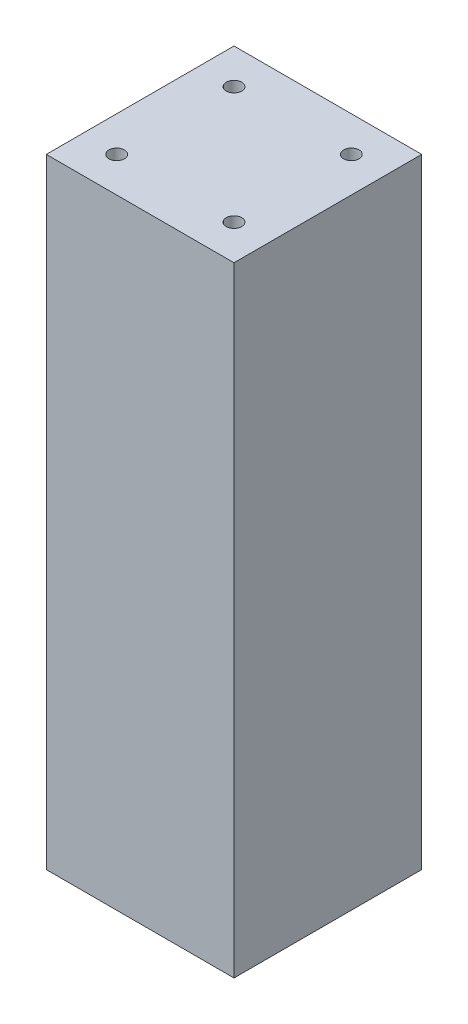
ISO-10303-21;
HEADER;
FILE_DESCRIPTION(('STEP AP214'),'2;1');
FILE_NAME('part.step','',(''),(''),'','','');
FILE_SCHEMA(('AUTOMOTIVE_DESIGN { 1 0 10303 214 1 1 1 1 }'));
ENDSEC;
DATA;
#1=APPLICATION_CONTEXT('core data for automotive mechanical design processes');
#2=APPLICATION_PROTOCOL_DEFINITION('international standard','automotive_design',2000,#1);
#3=PRODUCT_CONTEXT('',#1,'mechanical');
#4=PRODUCT('Part','Part','',(#3));
#5=PRODUCT_RELATED_PRODUCT_CATEGORY('part','',(#4));
#6=PRODUCT_DEFINITION_FORMATION('','',#4);
#7=PRODUCT_DEFINITION_CONTEXT('part definition',#1,'design');
#8=PRODUCT_DEFINITION('design','',#6,#7);
#9=PRODUCT_DEFINITION_SHAPE('','',#8);
#10=(LENGTH_UNIT() NAMED_UNIT(*) SI_UNIT(.MILLI.,.METRE.));
#11=(NAMED_UNIT(*) PLANE_ANGLE_UNIT() SI_UNIT($,.RADIAN.));
#12=(NAMED_UNIT(*) SI_UNIT($,.STERADIAN.) SOLID_ANGLE_UNIT());
#13=UNCERTAINTY_MEASURE_WITH_UNIT(LENGTH_MEASURE(1.E-05),#10,'distance_accuracy_value','');
#14=(GEOMETRIC_REPRESENTATION_CONTEXT(3) GLOBAL_UNCERTAINTY_ASSIGNED_CONTEXT((#13)) GLOBAL_UNIT_ASSIGNED_CONTEXT((#10,
#11,#12)) REPRESENTATION_CONTEXT('',''));
#15=CARTESIAN_POINT('',(0.,0.,0.));
#16=DIRECTION('',(0.,0.,1.));
#17=DIRECTION('',(1.,0.,0.));
#18=AXIS2_PLACEMENT_3D('',#15,#16,#17);
#19=CARTESIAN_POINT('',(-20.,66.,-20.));
#20=DIRECTION('',(1.,0.,0.));
#21=DIRECTION('',(0.,0.,-1.));
#22=AXIS2_PLACEMENT_3D('',#19,#20,#21);
#23=PLANE('',#22);
#24=DIRECTION('',(0.,0.,1.));
#25=VECTOR('',#24,1.);
#26=CARTESIAN_POINT('',(-20.,-66.,-20.));
#27=LINE('',#26,#25);
#28=CARTESIAN_POINT('',(-20.,-66.,-20.));
#29=VERTEX_POINT('',#28);
#30=CARTESIAN_POINT('',(-20.,-66.,20.));
#31=VERTEX_POINT('',#30);
#32=EDGE_CURVE('E171',#29,#31,#27,.T.);
#33=ORIENTED_EDGE('',*,*,#32,.T.);
#34=DIRECTION('',(0.,-1.,0.));
#35=VECTOR('',#34,1.);
#36=CARTESIAN_POINT('',(-20.,66.,20.));
#37=LINE('',#36,#35);
#38=CARTESIAN_POINT('',(-20.,66.,20.));
#39=VERTEX_POINT('',#38);
#40=EDGE_CURVE('E11',#39,#31,#37,.T.);
#41=ORIENTED_EDGE('',*,*,#40,.F.);
#42=DIRECTION('',(0.,0.,1.));
#43=VECTOR('',#42,1.);
#44=CARTESIAN_POINT('',(-20.,66.,-20.));
#45=LINE('',#44,#43);
#46=CARTESIAN_POINT('',(-20.,66.,-20.));
#47=VERTEX_POINT('',#46);
#48=EDGE_CURVE('E172',#47,#39,#45,.T.);
#49=ORIENTED_EDGE('',*,*,#48,.F.);
#50=DIRECTION('',(0.,-1.,0.));
#51=VECTOR('',#50,1.);
#52=CARTESIAN_POINT('',(-20.,66.,-20.));
#53=LINE('',#52,#51);
#54=EDGE_CURVE('E178',#47,#29,#53,.T.);
#55=ORIENTED_EDGE('',*,*,#54,.T.);
#56=EDGE_LOOP('',(#33,#41,#49,#55));
#57=FACE_BOUND('',#56,.T.);
#58=ADVANCED_FACE('F36',(#57),#23,.F.);
#59=CARTESIAN_POINT('',(-20.,66.,20.));
#60=DIRECTION('',(0.,0.,-1.));
#61=DIRECTION('',(-1.,0.,0.));
#62=AXIS2_PLACEMENT_3D('',#59,#60,#61);
#63=PLANE('',#62);
#64=DIRECTION('',(1.,0.,0.));
#65=VECTOR('',#64,1.);
#66=CARTESIAN_POINT('',(-20.,-66.,20.));
#67=LINE('',#66,#65);
#68=CARTESIAN_POINT('',(20.,-66.,20.));
#69=VERTEX_POINT('',#68);
#70=EDGE_CURVE('E181',#31,#69,#67,.T.);
#71=ORIENTED_EDGE('',*,*,#70,.T.);
#72=DIRECTION('',(0.,-1.,0.));
#73=VECTOR('',#72,1.);
#74=CARTESIAN_POINT('',(20.,66.,20.));
#75=LINE('',#74,#73);
#76=CARTESIAN_POINT('',(20.,66.,20.));
#77=VERTEX_POINT('',#76);
#78=EDGE_CURVE('E44',#77,#69,#75,.T.);
#79=ORIENTED_EDGE('',*,*,#78,.F.);
#80=DIRECTION('',(1.,0.,0.));
#81=VECTOR('',#80,1.);
#82=CARTESIAN_POINT('',(-20.,66.,20.));
#83=LINE('',#82,#81);
#84=EDGE_CURVE('E83',#39,#77,#83,.T.);
#85=ORIENTED_EDGE('',*,*,#84,.F.);
#86=ORIENTED_EDGE('',*,*,#40,.T.);
#87=EDGE_LOOP('',(#71,#79,#85,#86));
#88=FACE_BOUND('',#87,.T.);
#89=ADVANCED_FACE('F205',(#88),#63,.F.);
#90=CARTESIAN_POINT('',(20.,66.,-20.));
#91=DIRECTION('',(-1.,0.,0.));
#92=DIRECTION('',(0.,0.,1.));
#93=AXIS2_PLACEMENT_3D('',#90,#91,#92);
#94=PLANE('',#93);
#95=DIRECTION('',(0.,0.,-1.));
#96=VECTOR('',#95,1.);
#97=CARTESIAN_POINT('',(20.,-66.,-20.));
#98=LINE('',#97,#96);
#99=CARTESIAN_POINT('',(20.,-66.,-20.));
#100=VERTEX_POINT('',#99);
#101=EDGE_CURVE('E70',#69,#100,#98,.T.);
#102=ORIENTED_EDGE('',*,*,#101,.T.);
#103=DIRECTION('',(0.,-1.,0.));
#104=VECTOR('',#103,1.);
#105=CARTESIAN_POINT('',(20.,66.,-20.));
#106=LINE('',#105,#104);
#107=CARTESIAN_POINT('',(20.,66.,-20.));
#108=VERTEX_POINT('',#107);
#109=EDGE_CURVE('E186',#108,#100,#106,.T.);
#110=ORIENTED_EDGE('',*,*,#109,.F.);
#111=DIRECTION('',(0.,0.,-1.));
#112=VECTOR('',#111,1.);
#113=CARTESIAN_POINT('',(20.,66.,-20.));
#114=LINE('',#113,#112);
#115=EDGE_CURVE('E175',#77,#108,#114,.T.);
#116=ORIENTED_EDGE('',*,*,#115,.F.);
#117=ORIENTED_EDGE('',*,*,#78,.T.);
#118=EDGE_LOOP('',(#102,#110,#116,#117));
#119=FACE_BOUND('',#118,.T.);
#120=ADVANCED_FACE('F188',(#119),#94,.F.);
#121=CARTESIAN_POINT('',(-20.,66.,-20.));
#122=DIRECTION('',(0.,0.,1.));
#123=DIRECTION('',(1.,0.,0.));
#124=AXIS2_PLACEMENT_3D('',#121,#122,#123);
#125=PLANE('',#124);
#126=DIRECTION('',(-1.,0.,0.));
#127=VECTOR('',#126,1.);
#128=CARTESIAN_POINT('',(-20.,-66.,-20.));
#129=LINE('',#128,#127);
#130=EDGE_CURVE('E76',#100,#29,#129,.T.);
#131=ORIENTED_EDGE('',*,*,#130,.T.);
#132=ORIENTED_EDGE('',*,*,#54,.F.);
#133=DIRECTION('',(-1.,0.,0.));
#134=VECTOR('',#133,1.);
#135=CARTESIAN_POINT('',(-20.,66.,-20.));
#136=LINE('',#135,#134);
#137=EDGE_CURVE('E52',#108,#47,#136,.T.);
#138=ORIENTED_EDGE('',*,*,#137,.F.);
#139=ORIENTED_EDGE('',*,*,#109,.T.);
#140=EDGE_LOOP('',(#131,#132,#138,#139));
#141=FACE_BOUND('',#140,.T.);
#142=ADVANCED_FACE('F195',(#141),#125,.F.);
#143=CARTESIAN_POINT('',(0.,66.,0.));
#144=DIRECTION('',(0.,1.,0.));
#145=DIRECTION('',(0.,0.,1.));
#146=AXIS2_PLACEMENT_3D('',#143,#144,#145);
#147=PLANE('',#146);
#148=CARTESIAN_POINT('',(-12.5,66.,-12.5));
#149=DIRECTION('',(0.,1.,0.));
#150=DIRECTION('',(0.,0.,1.));
#151=AXIS2_PLACEMENT_3D('',#148,#149,#150);
#152=CIRCLE('',#151,1.65);
#153=CARTESIAN_POINT('',(-12.5,66.,-10.85));
#154=VERTEX_POINT('',#153);
#155=EDGE_CURVE('E147',#154,#154,#152,.T.);
#156=ORIENTED_EDGE('',*,*,#155,.F.);
#157=EDGE_LOOP('',(#156));
#158=FACE_BOUND('',#157,.T.);
#159=CARTESIAN_POINT('',(12.5,66.,-12.5));
#160=DIRECTION('',(0.,1.,0.));
#161=DIRECTION('',(0.,0.,1.));
#162=AXIS2_PLACEMENT_3D('',#159,#160,#161);
#163=CIRCLE('',#162,1.65);
#164=CARTESIAN_POINT('',(12.5,66.,-10.85));
#165=VERTEX_POINT('',#164);
#166=EDGE_CURVE('E153',#165,#165,#163,.T.);
#167=ORIENTED_EDGE('',*,*,#166,.F.);
#168=EDGE_LOOP('',(#167));
#169=FACE_BOUND('',#168,.T.);
#170=CARTESIAN_POINT('',(12.5,66.,12.5));
#171=DIRECTION('',(0.,1.,0.));
#172=DIRECTION('',(0.,0.,1.));
#173=AXIS2_PLACEMENT_3D('',#170,#171,#172);
#174=CIRCLE('',#173,1.65);
#175=CARTESIAN_POINT('',(12.5,66.,14.15));
#176=VERTEX_POINT('',#175);
#177=EDGE_CURVE('E159',#176,#176,#174,.T.);
#178=ORIENTED_EDGE('',*,*,#177,.F.);
#179=EDGE_LOOP('',(#178));
#180=FACE_BOUND('',#179,.T.);
#181=CARTESIAN_POINT('',(-12.5,66.,12.5));
#182=DIRECTION('',(0.,1.,0.));
#183=DIRECTION('',(0.,0.,1.));
#184=AXIS2_PLACEMENT_3D('',#181,#182,#183);
#185=CIRCLE('',#184,1.65);
#186=CARTESIAN_POINT('',(-12.5,66.,14.15));
#187=VERTEX_POINT('',#186);
#188=EDGE_CURVE('E165',#187,#187,#185,.T.);
#189=ORIENTED_EDGE('',*,*,#188,.F.);
#190=EDGE_LOOP('',(#189));
#191=FACE_BOUND('',#190,.T.);
#192=ORIENTED_EDGE('',*,*,#48,.T.);
#193=ORIENTED_EDGE('',*,*,#84,.T.);
#194=ORIENTED_EDGE('',*,*,#115,.T.);
#195=ORIENTED_EDGE('',*,*,#137,.T.);
#196=EDGE_LOOP('',(#192,#193,#194,#195));
#197=FACE_BOUND('',#196,.T.);
#198=ADVANCED_FACE('F197',(#158,#169,#180,#191,#197),#147,.T.);
#199=CARTESIAN_POINT('',(0.,-66.,0.));
#200=DIRECTION('',(0.,1.,0.));
#201=DIRECTION('',(0.,0.,1.));
#202=AXIS2_PLACEMENT_3D('',#199,#200,#201);
#203=PLANE('',#202);
#204=CARTESIAN_POINT('',(-10.,-66.,0.));
#205=DIRECTION('',(0.,-1.,0.));
#206=DIRECTION('',(0.,0.,-1.));
#207=AXIS2_PLACEMENT_3D('',#204,#205,#206);
#208=CIRCLE('',#207,3.);
#209=CARTESIAN_POINT('',(-10.,-66.,-3.));
#210=VERTEX_POINT('',#209);
#211=EDGE_CURVE('E119',#210,#210,#208,.T.);
#212=ORIENTED_EDGE('',*,*,#211,.F.);
#213=EDGE_LOOP('',(#212));
#214=FACE_BOUND('',#213,.T.);
#215=CARTESIAN_POINT('',(10.,-66.,0.));
#216=DIRECTION('',(0.,-1.,0.));
#217=DIRECTION('',(0.,0.,-1.));
#218=AXIS2_PLACEMENT_3D('',#215,#216,#217);
#219=CIRCLE('',#218,3.);
#220=CARTESIAN_POINT('',(10.,-66.,-3.));
#221=VERTEX_POINT('',#220);
#222=EDGE_CURVE('E118',#221,#221,#219,.T.);
#223=ORIENTED_EDGE('',*,*,#222,.F.);
#224=EDGE_LOOP('',(#223));
#225=FACE_BOUND('',#224,.T.);
#226=CARTESIAN_POINT('',(-10.,-66.,-12.5));
#227=DIRECTION('',(0.,-1.,0.));
#228=DIRECTION('',(0.,0.,-1.));
#229=AXIS2_PLACEMENT_3D('',#226,#227,#228);
#230=CIRCLE('',#229,3.025);
#231=CARTESIAN_POINT('',(-10.,-66.,-15.525));
#232=VERTEX_POINT('',#231);
#233=EDGE_CURVE('E129',#232,#232,#230,.T.);
#234=ORIENTED_EDGE('',*,*,#233,.F.);
#235=EDGE_LOOP('',(#234));
#236=FACE_BOUND('',#235,.T.);
#237=CARTESIAN_POINT('',(-10.,-66.,12.5));
#238=DIRECTION('',(0.,-1.,0.));
#239=DIRECTION('',(0.,0.,-1.));
#240=AXIS2_PLACEMENT_3D('',#237,#238,#239);
#241=CIRCLE('',#240,3.025);
#242=CARTESIAN_POINT('',(-10.,-66.,9.475));
#243=VERTEX_POINT('',#242);
#244=EDGE_CURVE('E138',#243,#243,#241,.T.);
#245=ORIENTED_EDGE('',*,*,#244,.F.);
#246=EDGE_LOOP('',(#245));
#247=FACE_BOUND('',#246,.T.);
#248=ORIENTED_EDGE('',*,*,#32,.F.);
#249=ORIENTED_EDGE('',*,*,#130,.F.);
#250=ORIENTED_EDGE('',*,*,#101,.F.);
#251=ORIENTED_EDGE('',*,*,#70,.F.);
#252=EDGE_LOOP('',(#248,#249,#250,#251));
#253=FACE_BOUND('',#252,.T.);
#254=ADVANCED_FACE('F191',(#214,#225,#236,#247,#253),#203,.F.);
#255=CARTESIAN_POINT('',(-12.5,54.5,12.5));
#256=DIRECTION('',(0.,1.,0.));
#257=DIRECTION('',(0.,0.,1.));
#258=AXIS2_PLACEMENT_3D('',#255,#256,#257);
#259=CONICAL_SURFACE('',#258,1.65,1.02974425867665);
#260=CARTESIAN_POINT('',(-12.5,53.5085799786045,12.5));
#261=VERTEX_POINT('',#260);
#262=VERTEX_LOOP('',#261);
#263=FACE_BOUND('',#262,.T.);
#264=CARTESIAN_POINT('',(-12.5,54.5,12.5));
#265=DIRECTION('',(0.,1.,0.));
#266=DIRECTION('',(0.,0.,1.));
#267=AXIS2_PLACEMENT_3D('',#264,#265,#266);
#268=CIRCLE('',#267,1.65);
#269=CARTESIAN_POINT('',(-12.5,54.5,14.15));
#270=VERTEX_POINT('',#269);
#271=EDGE_CURVE('E168',#270,#270,#268,.T.);
#272=ORIENTED_EDGE('',*,*,#271,.T.);
#273=EDGE_LOOP('',(#272));
#274=FACE_BOUND('',#273,.T.);
#275=ADVANCED_FACE('F235',(#263,#274),#259,.F.);
#276=CARTESIAN_POINT('',(-12.5,66.,12.5));
#277=DIRECTION('',(0.,1.,0.));
#278=DIRECTION('',(0.,0.,1.));
#279=AXIS2_PLACEMENT_3D('',#276,#277,#278);
#280=CYLINDRICAL_SURFACE('',#279,1.65);
#281=ORIENTED_EDGE('',*,*,#271,.F.);
#282=EDGE_LOOP('',(#281));
#283=FACE_BOUND('',#282,.T.);
#284=ORIENTED_EDGE('',*,*,#188,.T.);
#285=EDGE_LOOP('',(#284));
#286=FACE_BOUND('',#285,.T.);
#287=ADVANCED_FACE('F240',(#283,#286),#280,.F.);
#288=CARTESIAN_POINT('',(12.5,54.5,12.5));
#289=DIRECTION('',(0.,1.,0.));
#290=DIRECTION('',(0.,0.,1.));
#291=AXIS2_PLACEMENT_3D('',#288,#289,#290);
#292=CONICAL_SURFACE('',#291,1.65,1.02974425867665);
#293=CARTESIAN_POINT('',(12.5,53.5085799786045,12.5));
#294=VERTEX_POINT('',#293);
#295=VERTEX_LOOP('',#294);
#296=FACE_BOUND('',#295,.T.);
#297=CARTESIAN_POINT('',(12.5,54.5,12.5));
#298=DIRECTION('',(0.,1.,0.));
#299=DIRECTION('',(0.,0.,1.));
#300=AXIS2_PLACEMENT_3D('',#297,#298,#299);
#301=CIRCLE('',#300,1.65);
#302=CARTESIAN_POINT('',(12.5,54.5,14.15));
#303=VERTEX_POINT('',#302);
#304=EDGE_CURVE('E162',#303,#303,#301,.T.);
#305=ORIENTED_EDGE('',*,*,#304,.T.);
#306=EDGE_LOOP('',(#305));
#307=FACE_BOUND('',#306,.T.);
#308=ADVANCED_FACE('F251',(#296,#307),#292,.F.);
#309=CARTESIAN_POINT('',(12.5,66.,12.5));
#310=DIRECTION('',(0.,1.,0.));
#311=DIRECTION('',(0.,0.,1.));
#312=AXIS2_PLACEMENT_3D('',#309,#310,#311);
#313=CYLINDRICAL_SURFACE('',#312,1.65);
#314=ORIENTED_EDGE('',*,*,#304,.F.);
#315=EDGE_LOOP('',(#314));
#316=FACE_BOUND('',#315,.T.);
#317=ORIENTED_EDGE('',*,*,#177,.T.);
#318=EDGE_LOOP('',(#317));
#319=FACE_BOUND('',#318,.T.);
#320=ADVANCED_FACE('F264',(#316,#319),#313,.F.);
#321=CARTESIAN_POINT('',(12.5,54.5,-12.5));
#322=DIRECTION('',(0.,1.,0.));
#323=DIRECTION('',(0.,0.,1.));
#324=AXIS2_PLACEMENT_3D('',#321,#322,#323);
#325=CONICAL_SURFACE('',#324,1.65,1.02974425867665);
#326=CARTESIAN_POINT('',(12.5,53.5085799786045,-12.5));
#327=VERTEX_POINT('',#326);
#328=VERTEX_LOOP('',#327);
#329=FACE_BOUND('',#328,.T.);
#330=CARTESIAN_POINT('',(12.5,54.5,-12.5));
#331=DIRECTION('',(0.,1.,0.));
#332=DIRECTION('',(0.,0.,1.));
#333=AXIS2_PLACEMENT_3D('',#330,#331,#332);
#334=CIRCLE('',#333,1.65);
#335=CARTESIAN_POINT('',(12.5,54.5,-10.85));
#336=VERTEX_POINT('',#335);
#337=EDGE_CURVE('E156',#336,#336,#334,.T.);
#338=ORIENTED_EDGE('',*,*,#337,.T.);
#339=EDGE_LOOP('',(#338));
#340=FACE_BOUND('',#339,.T.);
#341=ADVANCED_FACE('F274',(#329,#340),#325,.F.);
#342=CARTESIAN_POINT('',(12.5,66.,-12.5));
#343=DIRECTION('',(0.,1.,0.));
#344=DIRECTION('',(0.,0.,1.));
#345=AXIS2_PLACEMENT_3D('',#342,#343,#344);
#346=CYLINDRICAL_SURFACE('',#345,1.65);
#347=ORIENTED_EDGE('',*,*,#337,.F.);
#348=EDGE_LOOP('',(#347));
#349=FACE_BOUND('',#348,.T.);
#350=ORIENTED_EDGE('',*,*,#166,.T.);
#351=EDGE_LOOP('',(#350));
#352=FACE_BOUND('',#351,.T.);
#353=ADVANCED_FACE('F286',(#349,#352),#346,.F.);
#354=CARTESIAN_POINT('',(-12.5,54.5,-12.5));
#355=DIRECTION('',(0.,1.,0.));
#356=DIRECTION('',(0.,0.,1.));
#357=AXIS2_PLACEMENT_3D('',#354,#355,#356);
#358=CONICAL_SURFACE('',#357,1.65,1.02974425867665);
#359=CARTESIAN_POINT('',(-12.5,53.5085799786045,-12.5));
#360=VERTEX_POINT('',#359);
#361=VERTEX_LOOP('',#360);
#362=FACE_BOUND('',#361,.T.);
#363=CARTESIAN_POINT('',(-12.5,54.5,-12.5));
#364=DIRECTION('',(0.,1.,0.));
#365=DIRECTION('',(0.,0.,1.));
#366=AXIS2_PLACEMENT_3D('',#363,#364,#365);
#367=CIRCLE('',#366,1.65);
#368=CARTESIAN_POINT('',(-12.5,54.5,-10.85));
#369=VERTEX_POINT('',#368);
#370=EDGE_CURVE('E150',#369,#369,#367,.T.);
#371=ORIENTED_EDGE('',*,*,#370,.T.);
#372=EDGE_LOOP('',(#371));
#373=FACE_BOUND('',#372,.T.);
#374=ADVANCED_FACE('F296',(#362,#373),#358,.F.);
#375=CARTESIAN_POINT('',(-12.5,66.,-12.5));
#376=DIRECTION('',(0.,1.,0.));
#377=DIRECTION('',(0.,0.,1.));
#378=AXIS2_PLACEMENT_3D('',#375,#376,#377);
#379=CYLINDRICAL_SURFACE('',#378,1.65);
#380=ORIENTED_EDGE('',*,*,#370,.F.);
#381=EDGE_LOOP('',(#380));
#382=FACE_BOUND('',#381,.T.);
#383=ORIENTED_EDGE('',*,*,#155,.T.);
#384=EDGE_LOOP('',(#383));
#385=FACE_BOUND('',#384,.T.);
#386=ADVANCED_FACE('F308',(#382,#385),#379,.F.);
#387=CARTESIAN_POINT('',(-10.,-49.,12.5));
#388=DIRECTION('',(0.,-1.,0.));
#389=DIRECTION('',(0.,0.,-1.));
#390=AXIS2_PLACEMENT_3D('',#387,#388,#389);
#391=CONICAL_SURFACE('',#390,2.5,1.02974425867665);
#392=CARTESIAN_POINT('',(-10.,-47.4978484524311,12.5));
#393=VERTEX_POINT('',#392);
#394=VERTEX_LOOP('',#393);
#395=FACE_BOUND('',#394,.T.);
#396=CARTESIAN_POINT('',(-10.,-49.,12.5));
#397=DIRECTION('',(0.,-1.,0.));
#398=DIRECTION('',(0.,0.,-1.));
#399=AXIS2_PLACEMENT_3D('',#396,#397,#398);
#400=CIRCLE('',#399,2.5);
#401=CARTESIAN_POINT('',(-10.,-49.,10.));
#402=VERTEX_POINT('',#401);
#403=EDGE_CURVE('E144',#402,#402,#400,.T.);
#404=ORIENTED_EDGE('',*,*,#403,.T.);
#405=EDGE_LOOP('',(#404));
#406=FACE_BOUND('',#405,.T.);
#407=ADVANCED_FACE('F318',(#395,#406),#391,.F.);
#408=CARTESIAN_POINT('',(-10.,-66.,12.5));
#409=DIRECTION('',(0.,-1.,0.));
#410=DIRECTION('',(0.,0.,-1.));
#411=AXIS2_PLACEMENT_3D('',#408,#409,#410);
#412=CYLINDRICAL_SURFACE('',#411,2.5);
#413=ORIENTED_EDGE('',*,*,#403,.F.);
#414=EDGE_LOOP('',(#413));
#415=FACE_BOUND('',#414,.T.);
#416=CARTESIAN_POINT('',(-10.,-65.475,12.5));
#417=DIRECTION('',(0.,-1.,0.));
#418=DIRECTION('',(0.,0.,-1.));
#419=AXIS2_PLACEMENT_3D('',#416,#417,#418);
#420=CIRCLE('',#419,2.5);
#421=CARTESIAN_POINT('',(-10.,-65.475,10.));
#422=VERTEX_POINT('',#421);
#423=EDGE_CURVE('E141',#422,#422,#420,.T.);
#424=ORIENTED_EDGE('',*,*,#423,.T.);
#425=EDGE_LOOP('',(#424));
#426=FACE_BOUND('',#425,.T.);
#427=ADVANCED_FACE('F329',(#415,#426),#412,.F.);
#428=CARTESIAN_POINT('',(-10.,-66.,12.5));
#429=DIRECTION('',(0.,-1.,0.));
#430=DIRECTION('',(0.,0.,-1.));
#431=AXIS2_PLACEMENT_3D('',#428,#429,#430);
#432=CONICAL_SURFACE('',#431,3.025,0.785398163397452);
#433=ORIENTED_EDGE('',*,*,#423,.F.);
#434=EDGE_LOOP('',(#433));
#435=FACE_BOUND('',#434,.T.);
#436=ORIENTED_EDGE('',*,*,#244,.T.);
#437=EDGE_LOOP('',(#436));
#438=FACE_BOUND('',#437,.T.);
#439=ADVANCED_FACE('F339',(#435,#438),#432,.F.);
#440=CARTESIAN_POINT('',(-10.,-49.,-12.5));
#441=DIRECTION('',(0.,-1.,0.));
#442=DIRECTION('',(0.,0.,-1.));
#443=AXIS2_PLACEMENT_3D('',#440,#441,#442);
#444=CONICAL_SURFACE('',#443,2.5,1.02974425867665);
#445=CARTESIAN_POINT('',(-10.,-47.4978484524311,-12.5));
#446=VERTEX_POINT('',#445);
#447=VERTEX_LOOP('',#446);
#448=FACE_BOUND('',#447,.T.);
#449=CARTESIAN_POINT('',(-10.,-49.,-12.5));
#450=DIRECTION('',(0.,-1.,0.));
#451=DIRECTION('',(0.,0.,-1.));
#452=AXIS2_PLACEMENT_3D('',#449,#450,#451);
#453=CIRCLE('',#452,2.5);
#454=CARTESIAN_POINT('',(-10.,-49.,-15.));
#455=VERTEX_POINT('',#454);
#456=EDGE_CURVE('E135',#455,#455,#453,.T.);
#457=ORIENTED_EDGE('',*,*,#456,.T.);
#458=EDGE_LOOP('',(#457));
#459=FACE_BOUND('',#458,.T.);
#460=ADVANCED_FACE('F351',(#448,#459),#444,.F.);
#461=CARTESIAN_POINT('',(-10.,-66.,-12.5));
#462=DIRECTION('',(0.,-1.,0.));
#463=DIRECTION('',(0.,0.,-1.));
#464=AXIS2_PLACEMENT_3D('',#461,#462,#463);
#465=CYLINDRICAL_SURFACE('',#464,2.5);
#466=ORIENTED_EDGE('',*,*,#456,.F.);
#467=EDGE_LOOP('',(#466));
#468=FACE_BOUND('',#467,.T.);
#469=CARTESIAN_POINT('',(-10.,-65.475,-12.5));
#470=DIRECTION('',(0.,-1.,0.));
#471=DIRECTION('',(0.,0.,-1.));
#472=AXIS2_PLACEMENT_3D('',#469,#470,#471);
#473=CIRCLE('',#472,2.5);
#474=CARTESIAN_POINT('',(-10.,-65.475,-15.));
#475=VERTEX_POINT('',#474);
#476=EDGE_CURVE('E132',#475,#475,#473,.T.);
#477=ORIENTED_EDGE('',*,*,#476,.T.);
#478=EDGE_LOOP('',(#477));
#479=FACE_BOUND('',#478,.T.);
#480=ADVANCED_FACE('F361',(#468,#479),#465,.F.);
#481=CARTESIAN_POINT('',(-10.,-66.,-12.5));
#482=DIRECTION('',(0.,-1.,0.));
#483=DIRECTION('',(0.,0.,-1.));
#484=AXIS2_PLACEMENT_3D('',#481,#482,#483);
#485=CONICAL_SURFACE('',#484,3.025,0.785398163397452);
#486=ORIENTED_EDGE('',*,*,#476,.F.);
#487=EDGE_LOOP('',(#486));
#488=FACE_BOUND('',#487,.T.);
#489=ORIENTED_EDGE('',*,*,#233,.T.);
#490=EDGE_LOOP('',(#489));
#491=FACE_BOUND('',#490,.T.);
#492=ADVANCED_FACE('F371',(#488,#491),#485,.F.);
#493=CARTESIAN_POINT('',(10.,-49.,0.));
#494=DIRECTION('',(0.,-1.,0.));
#495=DIRECTION('',(0.,0.,-1.));
#496=AXIS2_PLACEMENT_3D('',#493,#494,#495);
#497=CONICAL_SURFACE('',#496,3.,1.02974425867665);
#498=CARTESIAN_POINT('',(9.99999999999999,-47.1974181429173,0.));
#499=VERTEX_POINT('',#498);
#500=VERTEX_LOOP('',#499);
#501=FACE_BOUND('',#500,.T.);
#502=CARTESIAN_POINT('',(10.,-49.,0.));
#503=DIRECTION('',(0.,-1.,0.));
#504=DIRECTION('',(0.,0.,-1.));
#505=AXIS2_PLACEMENT_3D('',#502,#503,#504);
#506=CIRCLE('',#505,3.);
#507=CARTESIAN_POINT('',(10.,-49.,-2.99999999999999));
#508=VERTEX_POINT('',#507);
#509=EDGE_CURVE('E122',#508,#508,#506,.T.);
#510=ORIENTED_EDGE('',*,*,#509,.T.);
#511=EDGE_LOOP('',(#510));
#512=FACE_BOUND('',#511,.T.);
#513=ADVANCED_FACE('F382',(#501,#512),#497,.F.);
#514=CARTESIAN_POINT('',(10.,-66.,0.));
#515=DIRECTION('',(0.,-1.,0.));
#516=DIRECTION('',(0.,0.,-1.));
#517=AXIS2_PLACEMENT_3D('',#514,#515,#516);
#518=CYLINDRICAL_SURFACE('',#517,3.);
#519=ORIENTED_EDGE('',*,*,#509,.F.);
#520=EDGE_LOOP('',(#519));
#521=FACE_BOUND('',#520,.T.);
#522=ORIENTED_EDGE('',*,*,#222,.T.);
#523=EDGE_LOOP('',(#522));
#524=FACE_BOUND('',#523,.T.);
#525=ADVANCED_FACE('F112',(#521,#524),#518,.F.);
#526=CARTESIAN_POINT('',(-10.,-49.,0.));
#527=DIRECTION('',(0.,-1.,0.));
#528=DIRECTION('',(0.,0.,-1.));
#529=AXIS2_PLACEMENT_3D('',#526,#527,#528);
#530=CONICAL_SURFACE('',#529,3.,1.02974425867665);
#531=CARTESIAN_POINT('',(-10.,-47.1974181429173,0.));
#532=VERTEX_POINT('',#531);
#533=VERTEX_LOOP('',#532);
#534=FACE_BOUND('',#533,.T.);
#535=CARTESIAN_POINT('',(-10.,-49.,0.));
#536=DIRECTION('',(0.,-1.,0.));
#537=DIRECTION('',(0.,0.,-1.));
#538=AXIS2_PLACEMENT_3D('',#535,#536,#537);
#539=CIRCLE('',#538,3.);
#540=CARTESIAN_POINT('',(-10.,-49.,-2.99999999999999));
#541=VERTEX_POINT('',#540);
#542=EDGE_CURVE('E116',#541,#541,#539,.T.);
#543=ORIENTED_EDGE('',*,*,#542,.T.);
#544=EDGE_LOOP('',(#543));
#545=FACE_BOUND('',#544,.T.);
#546=ADVANCED_FACE('F108',(#534,#545),#530,.F.);
#547=CARTESIAN_POINT('',(-10.,-66.,0.));
#548=DIRECTION('',(0.,-1.,0.));
#549=DIRECTION('',(0.,0.,-1.));
#550=AXIS2_PLACEMENT_3D('',#547,#548,#549);
#551=CYLINDRICAL_SURFACE('',#550,3.);
#552=ORIENTED_EDGE('',*,*,#542,.F.);
#553=EDGE_LOOP('',(#552));
#554=FACE_BOUND('',#553,.T.);
#555=ORIENTED_EDGE('',*,*,#211,.T.);
#556=EDGE_LOOP('',(#555));
#557=FACE_BOUND('',#556,.T.);
#558=ADVANCED_FACE('F111',(#554,#557),#551,.F.);
#559=CLOSED_SHELL('',(#58,#89,#120,#142,#198,#254,#275,#287,#308,#320,#341,#353,#374,#386,#407,
#427,#439,#460,#480,#492,#513,#525,#546,#558));
#560=MANIFOLD_SOLID_BREP('B2',#559);
#561=ADVANCED_BREP_SHAPE_REPRESENTATION('',(#18,#560),#14);
#562=SHAPE_DEFINITION_REPRESENTATION(#9,#561);
ENDSEC;
END-ISO-10303-21;
